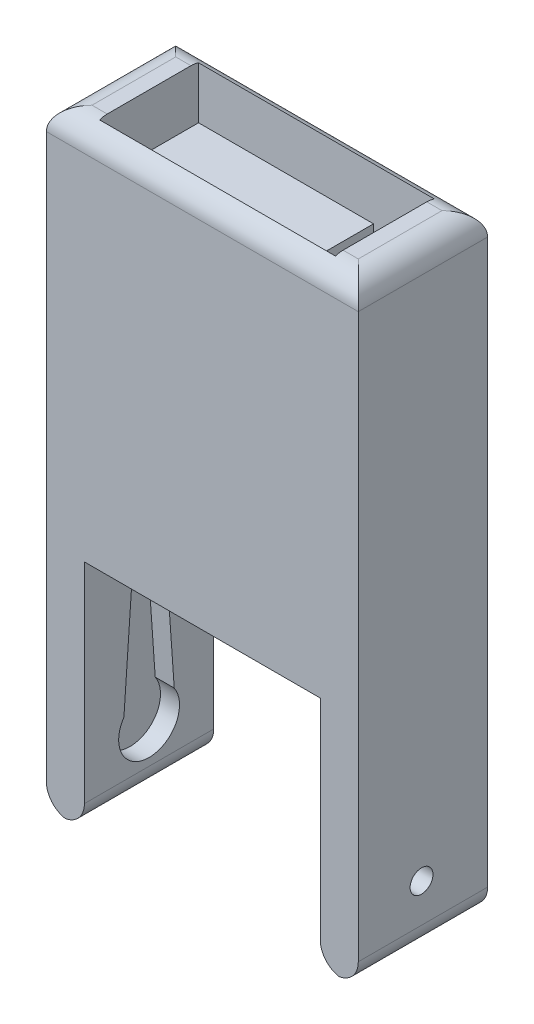
ISO-10303-21;
HEADER;
FILE_DESCRIPTION(('STEP AP214'),'2;1');
FILE_NAME('part.step','',(''),(''),'','','');
FILE_SCHEMA(('AUTOMOTIVE_DESIGN { 1 0 10303 214 1 1 1 1 }'));
ENDSEC;
DATA;
#1=APPLICATION_CONTEXT('core data for automotive mechanical design processes');
#2=APPLICATION_PROTOCOL_DEFINITION('international standard','automotive_design',2000,#1);
#3=PRODUCT_CONTEXT('',#1,'mechanical');
#4=PRODUCT('Part','Part','',(#3));
#5=PRODUCT_RELATED_PRODUCT_CATEGORY('part','',(#4));
#6=PRODUCT_DEFINITION_FORMATION('','',#4);
#7=PRODUCT_DEFINITION_CONTEXT('part definition',#1,'design');
#8=PRODUCT_DEFINITION('design','',#6,#7);
#9=PRODUCT_DEFINITION_SHAPE('','',#8);
#10=(LENGTH_UNIT() NAMED_UNIT(*) SI_UNIT(.MILLI.,.METRE.));
#11=(NAMED_UNIT(*) PLANE_ANGLE_UNIT() SI_UNIT($,.RADIAN.));
#12=(NAMED_UNIT(*) SI_UNIT($,.STERADIAN.) SOLID_ANGLE_UNIT());
#13=UNCERTAINTY_MEASURE_WITH_UNIT(LENGTH_MEASURE(1.E-05),#10,'distance_accuracy_value','');
#14=(GEOMETRIC_REPRESENTATION_CONTEXT(3) GLOBAL_UNCERTAINTY_ASSIGNED_CONTEXT((#13)) GLOBAL_UNIT_ASSIGNED_CONTEXT((#10,
#11,#12)) REPRESENTATION_CONTEXT('',''));
#15=CARTESIAN_POINT('',(0.,0.,0.));
#16=DIRECTION('',(0.,0.,1.));
#17=DIRECTION('',(1.,0.,0.));
#18=AXIS2_PLACEMENT_3D('',#15,#16,#17);
#19=CARTESIAN_POINT('',(5.,80.,0.));
#20=DIRECTION('',(-1.,0.,0.));
#21=DIRECTION('',(0.,0.,1.));
#22=AXIS2_PLACEMENT_3D('',#19,#20,#21);
#23=PLANE('',#22);
#24=DIRECTION('',(0.,-1.,0.));
#25=VECTOR('',#24,1.);
#26=CARTESIAN_POINT('',(5.,80.,15.));
#27=LINE('',#26,#25);
#28=CARTESIAN_POINT('',(5.,79.8284271247462,15.));
#29=VERTEX_POINT('',#28);
#30=CARTESIAN_POINT('',(5.,73.,15.));
#31=VERTEX_POINT('',#30);
#32=EDGE_CURVE('E53',#29,#31,#27,.T.);
#33=ORIENTED_EDGE('',*,*,#32,.T.);
#34=DIRECTION('',(0.,0.,-1.));
#35=VECTOR('',#34,1.);
#36=CARTESIAN_POINT('',(5.,73.,2.00000000000002));
#37=LINE('',#36,#35);
#38=CARTESIAN_POINT('',(5.,73.,2.00000000000001));
#39=VERTEX_POINT('',#38);
#40=EDGE_CURVE('E57',#31,#39,#37,.T.);
#41=ORIENTED_EDGE('',*,*,#40,.T.);
#42=DIRECTION('',(0.,1.,0.));
#43=VECTOR('',#42,1.);
#44=CARTESIAN_POINT('',(5.,80.,2.00000000000001));
#45=LINE('',#44,#43);
#46=CARTESIAN_POINT('',(5.,79.8284271247462,2.00000000000001));
#47=VERTEX_POINT('',#46);
#48=EDGE_CURVE('E246',#39,#47,#45,.T.);
#49=ORIENTED_EDGE('',*,*,#48,.T.);
#50=CARTESIAN_POINT('',(5.,77.,3.));
#51=DIRECTION('',(-1.,0.,0.));
#52=DIRECTION('',(0.,0.,1.));
#53=AXIS2_PLACEMENT_3D('',#50,#51,#52);
#54=CIRCLE('',#53,3.);
#55=CARTESIAN_POINT('',(5.,80.,3.));
#56=VERTEX_POINT('',#55);
#57=EDGE_CURVE('E391',#47,#56,#54,.F.);
#58=ORIENTED_EDGE('',*,*,#57,.T.);
#59=DIRECTION('',(0.,0.,-1.));
#60=VECTOR('',#59,1.);
#61=CARTESIAN_POINT('',(5.,80.,0.));
#62=LINE('',#61,#60);
#63=CARTESIAN_POINT('',(5.,80.,14.));
#64=VERTEX_POINT('',#63);
#65=EDGE_CURVE('E354',#64,#56,#62,.T.);
#66=ORIENTED_EDGE('',*,*,#65,.F.);
#67=CARTESIAN_POINT('',(5.,77.,14.));
#68=DIRECTION('',(-1.,0.,0.));
#69=DIRECTION('',(0.,0.,1.));
#70=AXIS2_PLACEMENT_3D('',#67,#68,#69);
#71=CIRCLE('',#70,3.);
#72=EDGE_CURVE('E393',#64,#29,#71,.F.);
#73=ORIENTED_EDGE('',*,*,#72,.T.);
#74=EDGE_LOOP('',(#33,#41,#49,#58,#66,#73));
#75=FACE_BOUND('',#74,.T.);
#76=ADVANCED_FACE('F36',(#75),#23,.F.);
#77=CARTESIAN_POINT('',(5.,25.2677997154365,8.5));
#78=DIRECTION('',(1.,0.,0.));
#79=DIRECTION('',(0.,0.,-1.));
#80=AXIS2_PLACEMENT_3D('',#77,#78,#79);
#81=CIRCLE('',#80,2.25);
#82=CARTESIAN_POINT('',(5.,25.2677997154365,10.75));
#83=VERTEX_POINT('',#82);
#84=CARTESIAN_POINT('',(5.,25.2677997154365,6.25));
#85=VERTEX_POINT('',#84);
#86=EDGE_CURVE('E340',#83,#85,#81,.F.);
#87=ORIENTED_EDGE('',*,*,#86,.T.);
#88=DIRECTION('',(0.,0.997531391051944,0.0702219614221419));
#89=VECTOR('',#88,1.);
#90=CARTESIAN_POINT('',(5.,-0.313205167656498,4.44920620628706));
#91=LINE('',#90,#89);
#92=CARTESIAN_POINT('',(5.,10.25,5.19281086116926));
#93=VERTEX_POINT('',#92);
#94=EDGE_CURVE('E331',#93,#85,#91,.T.);
#95=ORIENTED_EDGE('',*,*,#94,.F.);
#96=CARTESIAN_POINT('',(5.,8.,8.5));
#97=DIRECTION('',(1.,0.,0.));
#98=DIRECTION('',(0.,0.,-1.));
#99=AXIS2_PLACEMENT_3D('',#96,#97,#98);
#100=CIRCLE('',#99,4.);
#101=CARTESIAN_POINT('',(5.,10.25,11.8071891388307));
#102=VERTEX_POINT('',#101);
#103=EDGE_CURVE('E347',#102,#93,#100,.T.);
#104=ORIENTED_EDGE('',*,*,#103,.F.);
#105=DIRECTION('',(0.,0.997531391051944,-0.0702219614221418));
#106=VECTOR('',#105,1.);
#107=CARTESIAN_POINT('',(5.,0.877621216960529,12.4669646879914));
#108=LINE('',#107,#106);
#109=EDGE_CURVE('E343',#102,#83,#108,.T.);
#110=ORIENTED_EDGE('',*,*,#109,.T.);
#111=EDGE_LOOP('',(#87,#95,#104,#110));
#112=FACE_BOUND('',#111,.T.);
#113=DIRECTION('',(0.,0.,-1.));
#114=VECTOR('',#113,1.);
#115=CARTESIAN_POINT('',(5.,30.5177997154365,17.));
#116=LINE('',#115,#114);
#117=CARTESIAN_POINT('',(5.,30.5177997154365,17.));
#118=VERTEX_POINT('',#117);
#119=CARTESIAN_POINT('',(5.,30.5177997154365,0.));
#120=VERTEX_POINT('',#119);
#121=EDGE_CURVE('E308',#118,#120,#116,.T.);
#122=ORIENTED_EDGE('',*,*,#121,.F.);
#123=DIRECTION('',(0.,-1.,0.));
#124=VECTOR('',#123,1.);
#125=CARTESIAN_POINT('',(5.,80.,17.));
#126=LINE('',#125,#124);
#127=CARTESIAN_POINT('',(5.,3.,17.));
#128=VERTEX_POINT('',#127);
#129=EDGE_CURVE('E368',#118,#128,#126,.T.);
#130=ORIENTED_EDGE('',*,*,#129,.T.);
#131=DIRECTION('',(0.,0.,-1.));
#132=VECTOR('',#131,1.);
#133=CARTESIAN_POINT('',(5.,3.,0.));
#134=LINE('',#133,#132);
#135=CARTESIAN_POINT('',(5.,3.,0.));
#136=VERTEX_POINT('',#135);
#137=EDGE_CURVE('E395',#128,#136,#134,.T.);
#138=ORIENTED_EDGE('',*,*,#137,.T.);
#139=DIRECTION('',(0.,-1.,0.));
#140=VECTOR('',#139,1.);
#141=CARTESIAN_POINT('',(5.,80.,0.));
#142=LINE('',#141,#140);
#143=EDGE_CURVE('E366',#120,#136,#142,.T.);
#144=ORIENTED_EDGE('',*,*,#143,.F.);
#145=EDGE_LOOP('',(#122,#130,#138,#144));
#146=FACE_BOUND('',#145,.T.);
#147=ADVANCED_FACE('F451',(#112,#146),#23,.F.);
#148=CARTESIAN_POINT('',(0.,80.,0.));
#149=DIRECTION('',(1.,0.,0.));
#150=DIRECTION('',(0.,0.,-1.));
#151=AXIS2_PLACEMENT_3D('',#148,#149,#150);
#152=PLANE('',#151);
#153=DIRECTION('',(0.,-1.,0.));
#154=VECTOR('',#153,1.);
#155=CARTESIAN_POINT('',(0.,80.,0.));
#156=LINE('',#155,#154);
#157=CARTESIAN_POINT('',(0.,77.,0.));
#158=VERTEX_POINT('',#157);
#159=CARTESIAN_POINT('',(0.,3.,0.));
#160=VERTEX_POINT('',#159);
#161=EDGE_CURVE('E363',#158,#160,#156,.T.);
#162=ORIENTED_EDGE('',*,*,#161,.T.);
#163=DIRECTION('',(0.,0.,1.));
#164=VECTOR('',#163,1.);
#165=CARTESIAN_POINT('',(0.,3.,0.));
#166=LINE('',#165,#164);
#167=CARTESIAN_POINT('',(0.,3.,17.));
#168=VERTEX_POINT('',#167);
#169=EDGE_CURVE('E375',#160,#168,#166,.T.);
#170=ORIENTED_EDGE('',*,*,#169,.T.);
#171=DIRECTION('',(0.,-1.,0.));
#172=VECTOR('',#171,1.);
#173=CARTESIAN_POINT('',(0.,80.,17.));
#174=LINE('',#173,#172);
#175=CARTESIAN_POINT('',(0.,77.,17.));
#176=VERTEX_POINT('',#175);
#177=EDGE_CURVE('E370',#176,#168,#174,.T.);
#178=ORIENTED_EDGE('',*,*,#177,.F.);
#179=DIRECTION('',(0.,0.,1.));
#180=VECTOR('',#179,1.);
#181=CARTESIAN_POINT('',(0.,77.,0.));
#182=LINE('',#181,#180);
#183=EDGE_CURVE('E373',#176,#158,#182,.F.);
#184=ORIENTED_EDGE('',*,*,#183,.T.);
#185=EDGE_LOOP('',(#162,#170,#178,#184));
#186=FACE_BOUND('',#185,.T.);
#187=ADVANCED_FACE('F463',(#186),#152,.F.);
#188=CARTESIAN_POINT('',(0.,80.,17.));
#189=DIRECTION('',(0.,0.,-1.));
#190=DIRECTION('',(-1.,0.,0.));
#191=AXIS2_PLACEMENT_3D('',#188,#189,#190);
#192=PLANE('',#191);
#193=DIRECTION('',(1.,0.,0.));
#194=VECTOR('',#193,1.);
#195=CARTESIAN_POINT('',(-0.002000000000002,72.,17.));
#196=LINE('',#195,#194);
#197=CARTESIAN_POINT('',(5.,72.,17.));
#198=VERTEX_POINT('',#197);
#199=CARTESIAN_POINT('',(36.,72.,17.));
#200=VERTEX_POINT('',#199);
#201=EDGE_CURVE('E256',#198,#200,#196,.T.);
#202=ORIENTED_EDGE('',*,*,#201,.F.);
#203=ORIENTED_EDGE('',*,*,#201,.T.);
#204=EDGE_LOOP('',(#202,#203));
#205=FACE_BOUND('',#204,.T.);
#206=DIRECTION('',(-1.,0.,0.));
#207=VECTOR('',#206,1.);
#208=CARTESIAN_POINT('',(41.002,30.5177997154365,17.));
#209=LINE('',#208,#207);
#210=CARTESIAN_POINT('',(36.,30.5177997154365,17.));
#211=VERTEX_POINT('',#210);
#212=EDGE_CURVE('E320',#211,#118,#209,.T.);
#213=ORIENTED_EDGE('',*,*,#212,.F.);
#214=DIRECTION('',(0.,-1.,0.));
#215=VECTOR('',#214,1.);
#216=CARTESIAN_POINT('',(36.,80.,17.));
#217=LINE('',#216,#215);
#218=CARTESIAN_POINT('',(36.,3.,17.));
#219=VERTEX_POINT('',#218);
#220=EDGE_CURVE('E274',#211,#219,#217,.T.);
#221=ORIENTED_EDGE('',*,*,#220,.T.);
#222=CARTESIAN_POINT('',(39.,3.,17.));
#223=DIRECTION('',(0.,0.,-1.));
#224=DIRECTION('',(-1.,0.,0.));
#225=AXIS2_PLACEMENT_3D('',#222,#223,#224);
#226=CIRCLE('',#225,3.);
#227=CARTESIAN_POINT('',(38.5,0.041960108450196,17.));
#228=VERTEX_POINT('',#227);
#229=EDGE_CURVE('E285',#219,#228,#226,.F.);
#230=ORIENTED_EDGE('',*,*,#229,.T.);
#231=CARTESIAN_POINT('',(38.,3.,17.));
#232=DIRECTION('',(0.,0.,-1.));
#233=DIRECTION('',(-1.,0.,0.));
#234=AXIS2_PLACEMENT_3D('',#231,#232,#233);
#235=CIRCLE('',#234,3.);
#236=CARTESIAN_POINT('',(41.,3.,17.));
#237=VERTEX_POINT('',#236);
#238=EDGE_CURVE('E283',#228,#237,#235,.F.);
#239=ORIENTED_EDGE('',*,*,#238,.T.);
#240=DIRECTION('',(0.,-1.,0.));
#241=VECTOR('',#240,1.);
#242=CARTESIAN_POINT('',(41.,80.,17.));
#243=LINE('',#242,#241);
#244=CARTESIAN_POINT('',(41.,77.,17.));
#245=VERTEX_POINT('',#244);
#246=EDGE_CURVE('E271',#245,#237,#243,.T.);
#247=ORIENTED_EDGE('',*,*,#246,.F.);
#248=DIRECTION('',(1.,0.,0.));
#249=VECTOR('',#248,1.);
#250=CARTESIAN_POINT('',(0.,77.,17.));
#251=LINE('',#250,#249);
#252=EDGE_CURVE('E378',#245,#176,#251,.F.);
#253=ORIENTED_EDGE('',*,*,#252,.T.);
#254=ORIENTED_EDGE('',*,*,#177,.T.);
#255=CARTESIAN_POINT('',(3.,3.,17.));
#256=DIRECTION('',(0.,0.,-1.));
#257=DIRECTION('',(-1.,0.,0.));
#258=AXIS2_PLACEMENT_3D('',#255,#256,#257);
#259=CIRCLE('',#258,3.);
#260=CARTESIAN_POINT('',(2.5,0.0419601084501943,17.));
#261=VERTEX_POINT('',#260);
#262=EDGE_CURVE('E383',#168,#261,#259,.F.);
#263=ORIENTED_EDGE('',*,*,#262,.T.);
#264=CARTESIAN_POINT('',(2.,3.,17.));
#265=DIRECTION('',(0.,0.,-1.));
#266=DIRECTION('',(-1.,0.,0.));
#267=AXIS2_PLACEMENT_3D('',#264,#265,#266);
#268=CIRCLE('',#267,3.);
#269=EDGE_CURVE('E380',#261,#128,#268,.F.);
#270=ORIENTED_EDGE('',*,*,#269,.T.);
#271=ORIENTED_EDGE('',*,*,#129,.F.);
#272=EDGE_LOOP('',(#213,#221,#230,#239,#247,#253,#254,#263,#270,#271));
#273=FACE_BOUND('',#272,.T.);
#274=ADVANCED_FACE('F447',(#205,#273),#192,.F.);
#275=CARTESIAN_POINT('',(0.,80.,0.));
#276=DIRECTION('',(0.,0.,1.));
#277=DIRECTION('',(1.,0.,0.));
#278=AXIS2_PLACEMENT_3D('',#275,#276,#277);
#279=PLANE('',#278);
#280=DIRECTION('',(1.,0.,0.));
#281=VECTOR('',#280,1.);
#282=CARTESIAN_POINT('',(-0.00200000000000894,72.,0.));
#283=LINE('',#282,#281);
#284=CARTESIAN_POINT('',(5.,72.,0.));
#285=VERTEX_POINT('',#284);
#286=CARTESIAN_POINT('',(36.,72.,0.));
#287=VERTEX_POINT('',#286);
#288=EDGE_CURVE('E258',#285,#287,#283,.T.);
#289=ORIENTED_EDGE('',*,*,#288,.F.);
#290=ORIENTED_EDGE('',*,*,#288,.T.);
#291=EDGE_LOOP('',(#289,#290));
#292=FACE_BOUND('',#291,.T.);
#293=CARTESIAN_POINT('',(2.,3.,0.));
#294=DIRECTION('',(0.,0.,1.));
#295=DIRECTION('',(1.,0.,0.));
#296=AXIS2_PLACEMENT_3D('',#293,#294,#295);
#297=CIRCLE('',#296,3.);
#298=CARTESIAN_POINT('',(2.5,0.0419601084501947,0.));
#299=VERTEX_POINT('',#298);
#300=EDGE_CURVE('E387',#136,#299,#297,.F.);
#301=ORIENTED_EDGE('',*,*,#300,.T.);
#302=CARTESIAN_POINT('',(3.,3.,0.));
#303=DIRECTION('',(0.,0.,1.));
#304=DIRECTION('',(1.,0.,0.));
#305=AXIS2_PLACEMENT_3D('',#302,#303,#304);
#306=CIRCLE('',#305,3.);
#307=EDGE_CURVE('E389',#299,#160,#306,.F.);
#308=ORIENTED_EDGE('',*,*,#307,.T.);
#309=ORIENTED_EDGE('',*,*,#161,.F.);
#310=DIRECTION('',(-1.,0.,0.));
#311=VECTOR('',#310,1.);
#312=CARTESIAN_POINT('',(5.,77.,0.));
#313=LINE('',#312,#311);
#314=CARTESIAN_POINT('',(41.,77.,0.));
#315=VERTEX_POINT('',#314);
#316=EDGE_CURVE('E385',#158,#315,#313,.F.);
#317=ORIENTED_EDGE('',*,*,#316,.T.);
#318=DIRECTION('',(0.,-1.,0.));
#319=VECTOR('',#318,1.);
#320=CARTESIAN_POINT('',(41.,80.,0.));
#321=LINE('',#320,#319);
#322=CARTESIAN_POINT('',(41.,3.,0.));
#323=VERTEX_POINT('',#322);
#324=EDGE_CURVE('E268',#315,#323,#321,.T.);
#325=ORIENTED_EDGE('',*,*,#324,.T.);
#326=CARTESIAN_POINT('',(38.,3.,0.));
#327=DIRECTION('',(0.,0.,1.));
#328=DIRECTION('',(1.,0.,0.));
#329=AXIS2_PLACEMENT_3D('',#326,#327,#328);
#330=CIRCLE('',#329,3.);
#331=CARTESIAN_POINT('',(38.5,0.041960108450196,0.));
#332=VERTEX_POINT('',#331);
#333=EDGE_CURVE('E295',#323,#332,#330,.F.);
#334=ORIENTED_EDGE('',*,*,#333,.T.);
#335=CARTESIAN_POINT('',(39.,3.,0.));
#336=DIRECTION('',(0.,0.,1.));
#337=DIRECTION('',(1.,0.,0.));
#338=AXIS2_PLACEMENT_3D('',#335,#336,#337);
#339=CIRCLE('',#338,3.);
#340=CARTESIAN_POINT('',(36.,3.,0.));
#341=VERTEX_POINT('',#340);
#342=EDGE_CURVE('E297',#332,#341,#339,.F.);
#343=ORIENTED_EDGE('',*,*,#342,.T.);
#344=DIRECTION('',(0.,-1.,0.));
#345=VECTOR('',#344,1.);
#346=CARTESIAN_POINT('',(36.,80.,0.));
#347=LINE('',#346,#345);
#348=CARTESIAN_POINT('',(36.,30.5177997154365,0.));
#349=VERTEX_POINT('',#348);
#350=EDGE_CURVE('E266',#349,#341,#347,.T.);
#351=ORIENTED_EDGE('',*,*,#350,.F.);
#352=DIRECTION('',(-1.,0.,0.));
#353=VECTOR('',#352,1.);
#354=CARTESIAN_POINT('',(41.002,30.5177997154365,0.));
#355=LINE('',#354,#353);
#356=EDGE_CURVE('E319',#349,#120,#355,.T.);
#357=ORIENTED_EDGE('',*,*,#356,.T.);
#358=ORIENTED_EDGE('',*,*,#143,.T.);
#359=EDGE_LOOP('',(#301,#308,#309,#317,#325,#334,#343,#351,#357,#358));
#360=FACE_BOUND('',#359,.T.);
#361=ADVANCED_FACE('F422',(#292,#360),#279,.F.);
#362=CARTESIAN_POINT('',(0.,80.,0.));
#363=DIRECTION('',(0.,1.,0.));
#364=DIRECTION('',(0.,0.,1.));
#365=AXIS2_PLACEMENT_3D('',#362,#363,#364);
#366=PLANE('',#365);
#367=DIRECTION('',(0.,0.,1.));
#368=VECTOR('',#367,1.);
#369=CARTESIAN_POINT('',(3.,80.,17.));
#370=LINE('',#369,#368);
#371=CARTESIAN_POINT('',(3.,80.,3.));
#372=VERTEX_POINT('',#371);
#373=CARTESIAN_POINT('',(3.,80.,14.));
#374=VERTEX_POINT('',#373);
#375=EDGE_CURVE('E45',#372,#374,#370,.T.);
#376=ORIENTED_EDGE('',*,*,#375,.T.);
#377=DIRECTION('',(1.,0.,0.));
#378=VECTOR('',#377,1.);
#379=CARTESIAN_POINT('',(5.,80.,14.));
#380=LINE('',#379,#378);
#381=EDGE_CURVE('E11',#374,#64,#380,.T.);
#382=ORIENTED_EDGE('',*,*,#381,.T.);
#383=ORIENTED_EDGE('',*,*,#65,.T.);
#384=DIRECTION('',(-1.,0.,0.));
#385=VECTOR('',#384,1.);
#386=CARTESIAN_POINT('',(0.,80.,3.));
#387=LINE('',#386,#385);
#388=EDGE_CURVE('E398',#56,#372,#387,.T.);
#389=ORIENTED_EDGE('',*,*,#388,.T.);
#390=EDGE_LOOP('',(#376,#382,#383,#389));
#391=FACE_BOUND('',#390,.T.);
#392=ADVANCED_FACE('F605',(#391),#366,.T.);
#393=CARTESIAN_POINT('',(2.5,25.2677997154365,8.5));
#394=DIRECTION('',(1.,0.,0.));
#395=DIRECTION('',(0.,0.,-1.));
#396=AXIS2_PLACEMENT_3D('',#393,#394,#395);
#397=CYLINDRICAL_SURFACE('',#396,2.25);
#398=ORIENTED_EDGE('',*,*,#86,.F.);
#399=DIRECTION('',(1.,0.,0.));
#400=VECTOR('',#399,1.);
#401=CARTESIAN_POINT('',(2.5,25.2677997154365,10.75));
#402=LINE('',#401,#400);
#403=CARTESIAN_POINT('',(2.5,25.2677997154365,10.75));
#404=VERTEX_POINT('',#403);
#405=EDGE_CURVE('E339',#404,#83,#402,.T.);
#406=ORIENTED_EDGE('',*,*,#405,.F.);
#407=CARTESIAN_POINT('',(2.5,25.2677997154365,8.5));
#408=DIRECTION('',(1.,0.,0.));
#409=DIRECTION('',(0.,0.,-1.));
#410=AXIS2_PLACEMENT_3D('',#407,#408,#409);
#411=CIRCLE('',#410,2.25);
#412=CARTESIAN_POINT('',(2.5,25.2677997154365,6.25));
#413=VERTEX_POINT('',#412);
#414=EDGE_CURVE('E328',#404,#413,#411,.F.);
#415=ORIENTED_EDGE('',*,*,#414,.T.);
#416=DIRECTION('',(1.,0.,0.));
#417=VECTOR('',#416,1.);
#418=CARTESIAN_POINT('',(2.5,25.2677997154365,6.25));
#419=LINE('',#418,#417);
#420=EDGE_CURVE('E352',#413,#85,#419,.T.);
#421=ORIENTED_EDGE('',*,*,#420,.T.);
#422=EDGE_LOOP('',(#398,#406,#415,#421));
#423=FACE_BOUND('',#422,.T.);
#424=ADVANCED_FACE('F597',(#423),#397,.F.);
#425=CARTESIAN_POINT('',(2.5,-0.313205167656498,4.44920620628706));
#426=DIRECTION('',(0.,0.0702219614221419,-0.997531391051944));
#427=DIRECTION('',(0.,0.997531391051944,0.0702219614221419));
#428=AXIS2_PLACEMENT_3D('',#425,#426,#427);
#429=PLANE('',#428);
#430=ORIENTED_EDGE('',*,*,#94,.T.);
#431=ORIENTED_EDGE('',*,*,#420,.F.);
#432=DIRECTION('',(0.,0.997531391051944,0.0702219614221419));
#433=VECTOR('',#432,1.);
#434=CARTESIAN_POINT('',(2.5,-0.313205167656498,4.44920620628706));
#435=LINE('',#434,#433);
#436=CARTESIAN_POINT('',(2.5,10.25,5.19281086116926));
#437=VERTEX_POINT('',#436);
#438=EDGE_CURVE('E336',#437,#413,#435,.T.);
#439=ORIENTED_EDGE('',*,*,#438,.F.);
#440=DIRECTION('',(1.,0.,0.));
#441=VECTOR('',#440,1.);
#442=CARTESIAN_POINT('',(2.5,10.25,5.19281086116926));
#443=LINE('',#442,#441);
#444=EDGE_CURVE('E355',#437,#93,#443,.T.);
#445=ORIENTED_EDGE('',*,*,#444,.T.);
#446=EDGE_LOOP('',(#430,#431,#439,#445));
#447=FACE_BOUND('',#446,.T.);
#448=ADVANCED_FACE('F589',(#447),#429,.F.);
#449=CARTESIAN_POINT('',(2.5,8.,8.5));
#450=DIRECTION('',(1.,0.,0.));
#451=DIRECTION('',(0.,0.,-1.));
#452=AXIS2_PLACEMENT_3D('',#449,#450,#451);
#453=CYLINDRICAL_SURFACE('',#452,4.);
#454=ORIENTED_EDGE('',*,*,#103,.T.);
#455=ORIENTED_EDGE('',*,*,#444,.F.);
#456=CARTESIAN_POINT('',(2.5,8.,8.5));
#457=DIRECTION('',(1.,0.,0.));
#458=DIRECTION('',(0.,0.,-1.));
#459=AXIS2_PLACEMENT_3D('',#456,#457,#458);
#460=CIRCLE('',#459,4.);
#461=CARTESIAN_POINT('',(2.5,10.25,11.8071891388307));
#462=VERTEX_POINT('',#461);
#463=EDGE_CURVE('E333',#462,#437,#460,.T.);
#464=ORIENTED_EDGE('',*,*,#463,.F.);
#465=DIRECTION('',(1.,0.,0.));
#466=VECTOR('',#465,1.);
#467=CARTESIAN_POINT('',(2.5,10.25,11.8071891388307));
#468=LINE('',#467,#466);
#469=EDGE_CURVE('E357',#462,#102,#468,.T.);
#470=ORIENTED_EDGE('',*,*,#469,.T.);
#471=EDGE_LOOP('',(#454,#455,#464,#470));
#472=FACE_BOUND('',#471,.T.);
#473=ADVANCED_FACE('F581',(#472),#453,.F.);
#474=CARTESIAN_POINT('',(2.5,0.877621216960529,12.4669646879914));
#475=DIRECTION('',(0.,-0.0702219614221418,-0.997531391051944));
#476=DIRECTION('',(0.,0.997531391051944,-0.0702219614221418));
#477=AXIS2_PLACEMENT_3D('',#474,#475,#476);
#478=PLANE('',#477);
#479=ORIENTED_EDGE('',*,*,#109,.F.);
#480=ORIENTED_EDGE('',*,*,#469,.F.);
#481=DIRECTION('',(0.,0.997531391051944,-0.0702219614221418));
#482=VECTOR('',#481,1.);
#483=CARTESIAN_POINT('',(2.5,0.877621216960529,12.4669646879914));
#484=LINE('',#483,#482);
#485=EDGE_CURVE('E330',#462,#404,#484,.T.);
#486=ORIENTED_EDGE('',*,*,#485,.T.);
#487=ORIENTED_EDGE('',*,*,#405,.T.);
#488=EDGE_LOOP('',(#479,#480,#486,#487));
#489=FACE_BOUND('',#488,.T.);
#490=ADVANCED_FACE('F572',(#489),#478,.T.);
#491=CARTESIAN_POINT('',(2.5,0.,0.));
#492=DIRECTION('',(1.,0.,0.));
#493=DIRECTION('',(0.,0.,-1.));
#494=AXIS2_PLACEMENT_3D('',#491,#492,#493);
#495=PLANE('',#494);
#496=ORIENTED_EDGE('',*,*,#414,.F.);
#497=ORIENTED_EDGE('',*,*,#485,.F.);
#498=ORIENTED_EDGE('',*,*,#463,.T.);
#499=ORIENTED_EDGE('',*,*,#438,.T.);
#500=EDGE_LOOP('',(#496,#497,#498,#499));
#501=FACE_BOUND('',#500,.T.);
#502=ADVANCED_FACE('F547',(#501),#495,.T.);
#503=CARTESIAN_POINT('',(2.,3.,0.));
#504=DIRECTION('',(0.,0.,-1.));
#505=DIRECTION('',(-1.,0.,0.));
#506=AXIS2_PLACEMENT_3D('',#503,#504,#505);
#507=CYLINDRICAL_SURFACE('',#506,3.);
#508=DIRECTION('',(0.,0.,-1.));
#509=VECTOR('',#508,1.);
#510=CARTESIAN_POINT('',(2.5,0.0419601084501939,8.5));
#511=LINE('',#510,#509);
#512=EDGE_CURVE('E344',#299,#261,#511,.F.);
#513=ORIENTED_EDGE('',*,*,#512,.F.);
#514=ORIENTED_EDGE('',*,*,#300,.F.);
#515=ORIENTED_EDGE('',*,*,#137,.F.);
#516=ORIENTED_EDGE('',*,*,#269,.F.);
#517=EDGE_LOOP('',(#513,#514,#515,#516));
#518=FACE_BOUND('',#517,.T.);
#519=ADVANCED_FACE('F457',(#518),#507,.T.);
#520=CARTESIAN_POINT('',(3.,3.,0.));
#521=DIRECTION('',(0.,0.,1.));
#522=DIRECTION('',(1.,0.,0.));
#523=AXIS2_PLACEMENT_3D('',#520,#521,#522);
#524=CYLINDRICAL_SURFACE('',#523,3.);
#525=ORIENTED_EDGE('',*,*,#307,.F.);
#526=ORIENTED_EDGE('',*,*,#512,.T.);
#527=ORIENTED_EDGE('',*,*,#262,.F.);
#528=ORIENTED_EDGE('',*,*,#169,.F.);
#529=EDGE_LOOP('',(#525,#526,#527,#528));
#530=FACE_BOUND('',#529,.T.);
#531=ADVANCED_FACE('F460',(#530),#524,.T.);
#532=CARTESIAN_POINT('',(0.,77.,3.));
#533=DIRECTION('',(1.,0.,0.));
#534=DIRECTION('',(0.,0.,-1.));
#535=AXIS2_PLACEMENT_3D('',#532,#533,#534);
#536=CYLINDRICAL_SURFACE('',#535,3.);
#537=ORIENTED_EDGE('',*,*,#57,.F.);
#538=DIRECTION('',(1.,0.,0.));
#539=VECTOR('',#538,1.);
#540=CARTESIAN_POINT('',(36.,79.8284271247462,2.));
#541=LINE('',#540,#539);
#542=CARTESIAN_POINT('',(36.,79.8284271247462,2.));
#543=VERTEX_POINT('',#542);
#544=EDGE_CURVE('E293',#543,#47,#541,.F.);
#545=ORIENTED_EDGE('',*,*,#544,.F.);
#546=CARTESIAN_POINT('',(36.,77.,3.));
#547=DIRECTION('',(1.,0.,0.));
#548=DIRECTION('',(0.,0.,-1.));
#549=AXIS2_PLACEMENT_3D('',#546,#547,#548);
#550=CIRCLE('',#549,3.);
#551=CARTESIAN_POINT('',(36.,80.,3.));
#552=VERTEX_POINT('',#551);
#553=EDGE_CURVE('E289',#552,#543,#550,.F.);
#554=ORIENTED_EDGE('',*,*,#553,.F.);
#555=DIRECTION('',(-1.,0.,0.));
#556=VECTOR('',#555,1.);
#557=CARTESIAN_POINT('',(5.,80.,3.));
#558=LINE('',#557,#556);
#559=CARTESIAN_POINT('',(38.,80.,3.));
#560=VERTEX_POINT('',#559);
#561=EDGE_CURVE('E278',#560,#552,#558,.T.);
#562=ORIENTED_EDGE('',*,*,#561,.F.);
#563=CARTESIAN_POINT('',(38.,77.,3.));
#564=DIRECTION('',(0.707106781186547,0.,0.707106781186547));
#565=DIRECTION('',(-0.707106781186547,0.,0.707106781186547));
#566=AXIS2_PLACEMENT_3D('',#563,#564,#565);
#567=ELLIPSE('',#566,4.24264068711928,3.);
#568=EDGE_CURVE('E311',#315,#560,#567,.T.);
#569=ORIENTED_EDGE('',*,*,#568,.F.);
#570=ORIENTED_EDGE('',*,*,#316,.F.);
#571=CARTESIAN_POINT('',(3.,77.,3.));
#572=DIRECTION('',(0.707106781186547,0.,-0.707106781186548));
#573=DIRECTION('',(0.707106781186548,0.,0.707106781186547));
#574=AXIS2_PLACEMENT_3D('',#571,#572,#573);
#575=ELLIPSE('',#574,4.24264068711929,3.);
#576=EDGE_CURVE('E40',#372,#158,#575,.F.);
#577=ORIENTED_EDGE('',*,*,#576,.F.);
#578=ORIENTED_EDGE('',*,*,#388,.F.);
#579=EDGE_LOOP('',(#537,#545,#554,#562,#569,#570,#577,#578));
#580=FACE_BOUND('',#579,.T.);
#581=ADVANCED_FACE('F38',(#580),#536,.T.);
#582=CARTESIAN_POINT('',(3.,77.,0.));
#583=DIRECTION('',(0.,0.,-1.));
#584=DIRECTION('',(-1.,0.,0.));
#585=AXIS2_PLACEMENT_3D('',#582,#583,#584);
#586=CYLINDRICAL_SURFACE('',#585,3.);
#587=ORIENTED_EDGE('',*,*,#576,.T.);
#588=ORIENTED_EDGE('',*,*,#183,.F.);
#589=CARTESIAN_POINT('',(3.,77.,14.));
#590=DIRECTION('',(-0.707106781186548,0.,-0.707106781186547));
#591=DIRECTION('',(0.707106781186547,0.,-0.707106781186548));
#592=AXIS2_PLACEMENT_3D('',#589,#590,#591);
#593=ELLIPSE('',#592,4.24264068711928,3.);
#594=EDGE_CURVE('E327',#374,#176,#593,.F.);
#595=ORIENTED_EDGE('',*,*,#594,.F.);
#596=ORIENTED_EDGE('',*,*,#375,.F.);
#597=EDGE_LOOP('',(#587,#588,#595,#596));
#598=FACE_BOUND('',#597,.T.);
#599=ADVANCED_FACE('F411',(#598),#586,.T.);
#600=CARTESIAN_POINT('',(0.,77.,14.));
#601=DIRECTION('',(-1.,0.,0.));
#602=DIRECTION('',(0.,0.,1.));
#603=AXIS2_PLACEMENT_3D('',#600,#601,#602);
#604=CYLINDRICAL_SURFACE('',#603,3.);
#605=ORIENTED_EDGE('',*,*,#594,.T.);
#606=ORIENTED_EDGE('',*,*,#252,.F.);
#607=CARTESIAN_POINT('',(38.,77.,14.));
#608=DIRECTION('',(-0.707106781186547,0.,0.707106781186547));
#609=DIRECTION('',(0.707106781186547,0.,0.707106781186547));
#610=AXIS2_PLACEMENT_3D('',#607,#608,#609);
#611=ELLIPSE('',#610,4.24264068711928,3.);
#612=CARTESIAN_POINT('',(38.,80.,14.));
#613=VERTEX_POINT('',#612);
#614=EDGE_CURVE('E309',#245,#613,#611,.T.);
#615=ORIENTED_EDGE('',*,*,#614,.T.);
#616=DIRECTION('',(1.,0.,0.));
#617=VECTOR('',#616,1.);
#618=CARTESIAN_POINT('',(41.,80.,14.));
#619=LINE('',#618,#617);
#620=CARTESIAN_POINT('',(36.,80.,14.));
#621=VERTEX_POINT('',#620);
#622=EDGE_CURVE('E280',#621,#613,#619,.T.);
#623=ORIENTED_EDGE('',*,*,#622,.F.);
#624=CARTESIAN_POINT('',(36.,77.,14.));
#625=DIRECTION('',(1.,0.,0.));
#626=DIRECTION('',(0.,0.,-1.));
#627=AXIS2_PLACEMENT_3D('',#624,#625,#626);
#628=CIRCLE('',#627,3.);
#629=CARTESIAN_POINT('',(36.,79.8284271247462,15.));
#630=VERTEX_POINT('',#629);
#631=EDGE_CURVE('E291',#630,#621,#628,.F.);
#632=ORIENTED_EDGE('',*,*,#631,.F.);
#633=DIRECTION('',(-1.,0.,0.));
#634=VECTOR('',#633,1.);
#635=CARTESIAN_POINT('',(5.,79.8284271247462,15.));
#636=LINE('',#635,#634);
#637=EDGE_CURVE('E287',#29,#630,#636,.F.);
#638=ORIENTED_EDGE('',*,*,#637,.F.);
#639=ORIENTED_EDGE('',*,*,#72,.F.);
#640=ORIENTED_EDGE('',*,*,#381,.F.);
#641=EDGE_LOOP('',(#605,#606,#615,#623,#632,#638,#639,#640));
#642=FACE_BOUND('',#641,.T.);
#643=ADVANCED_FACE('F465',(#642),#604,.T.);
#644=CARTESIAN_POINT('',(41.002,30.5177997154365,17.));
#645=DIRECTION('',(0.,1.,0.));
#646=DIRECTION('',(0.,0.,1.));
#647=AXIS2_PLACEMENT_3D('',#644,#645,#646);
#648=PLANE('',#647);
#649=DIRECTION('',(0.,0.,-1.));
#650=VECTOR('',#649,1.);
#651=CARTESIAN_POINT('',(36.,30.5177997154365,17.));
#652=LINE('',#651,#650);
#653=EDGE_CURVE('E322',#211,#349,#652,.T.);
#654=ORIENTED_EDGE('',*,*,#653,.F.);
#655=ORIENTED_EDGE('',*,*,#212,.T.);
#656=ORIENTED_EDGE('',*,*,#121,.T.);
#657=ORIENTED_EDGE('',*,*,#356,.F.);
#658=EDGE_LOOP('',(#654,#655,#656,#657));
#659=FACE_BOUND('',#658,.T.);
#660=ADVANCED_FACE('F443',(#659),#648,.F.);
#661=CARTESIAN_POINT('',(36.,80.,0.));
#662=DIRECTION('',(1.,0.,0.));
#663=DIRECTION('',(0.,0.,-1.));
#664=AXIS2_PLACEMENT_3D('',#661,#662,#663);
#665=PLANE('',#664);
#666=CARTESIAN_POINT('',(36.,8.0419601084502,8.68637656111559));
#667=DIRECTION('',(-1.,0.,0.));
#668=DIRECTION('',(0.,0.,1.));
#669=AXIS2_PLACEMENT_3D('',#666,#667,#668);
#670=CIRCLE('',#669,1.5);
#671=CARTESIAN_POINT('',(36.,8.0419601084502,10.1863765611156));
#672=VERTEX_POINT('',#671);
#673=EDGE_CURVE('E503',#672,#672,#670,.T.);
#674=ORIENTED_EDGE('',*,*,#673,.F.);
#675=EDGE_LOOP('',(#674));
#676=FACE_BOUND('',#675,.T.);
#677=ORIENTED_EDGE('',*,*,#220,.F.);
#678=ORIENTED_EDGE('',*,*,#653,.T.);
#679=ORIENTED_EDGE('',*,*,#350,.T.);
#680=DIRECTION('',(0.,0.,1.));
#681=VECTOR('',#680,1.);
#682=CARTESIAN_POINT('',(36.,3.,0.));
#683=LINE('',#682,#681);
#684=EDGE_CURVE('E300',#341,#219,#683,.T.);
#685=ORIENTED_EDGE('',*,*,#684,.T.);
#686=EDGE_LOOP('',(#677,#678,#679,#685));
#687=FACE_BOUND('',#686,.T.);
#688=ADVANCED_FACE('F440',(#676,#687),#665,.F.);
#689=CARTESIAN_POINT('',(-0.00200000000000894,73.,2.00000000000002));
#690=DIRECTION('',(0.,-1.,0.));
#691=DIRECTION('',(0.,0.,-1.));
#692=AXIS2_PLACEMENT_3D('',#689,#690,#691);
#693=PLANE('',#692);
#694=DIRECTION('',(1.,0.,0.));
#695=VECTOR('',#694,1.);
#696=CARTESIAN_POINT('',(-0.00200000000000894,73.,2.00000000000002));
#697=LINE('',#696,#695);
#698=CARTESIAN_POINT('',(31.,73.,2.));
#699=VERTEX_POINT('',#698);
#700=CARTESIAN_POINT('',(36.,73.,2.));
#701=VERTEX_POINT('',#700);
#702=EDGE_CURVE('E248',#699,#701,#697,.T.);
#703=ORIENTED_EDGE('',*,*,#702,.F.);
#704=DIRECTION('',(0.,0.,-1.));
#705=VECTOR('',#704,1.);
#706=CARTESIAN_POINT('',(31.,73.,15.));
#707=LINE('',#706,#705);
#708=CARTESIAN_POINT('',(31.,73.,15.));
#709=VERTEX_POINT('',#708);
#710=EDGE_CURVE('E241',#709,#699,#707,.T.);
#711=ORIENTED_EDGE('',*,*,#710,.F.);
#712=DIRECTION('',(1.,0.,0.));
#713=VECTOR('',#712,1.);
#714=CARTESIAN_POINT('',(-0.002000000000002,73.,15.));
#715=LINE('',#714,#713);
#716=CARTESIAN_POINT('',(36.,73.,15.));
#717=VERTEX_POINT('',#716);
#718=EDGE_CURVE('E247',#709,#717,#715,.T.);
#719=ORIENTED_EDGE('',*,*,#718,.T.);
#720=DIRECTION('',(0.,0.,-1.));
#721=VECTOR('',#720,1.);
#722=CARTESIAN_POINT('',(36.,73.,2.));
#723=LINE('',#722,#721);
#724=EDGE_CURVE('E484',#717,#701,#723,.T.);
#725=ORIENTED_EDGE('',*,*,#724,.T.);
#726=EDGE_LOOP('',(#703,#711,#719,#725));
#727=FACE_BOUND('',#726,.T.);
#728=ADVANCED_FACE('F518',(#727),#693,.F.);
#729=DIRECTION('',(0.,-1.,0.));
#730=VECTOR('',#729,1.);
#731=CARTESIAN_POINT('',(36.,80.,15.));
#732=LINE('',#731,#730);
#733=EDGE_CURVE('E485',#630,#717,#732,.T.);
#734=ORIENTED_EDGE('',*,*,#733,.F.);
#735=ORIENTED_EDGE('',*,*,#631,.T.);
#736=DIRECTION('',(0.,0.,1.));
#737=VECTOR('',#736,1.);
#738=CARTESIAN_POINT('',(36.,80.,0.));
#739=LINE('',#738,#737);
#740=EDGE_CURVE('E261',#552,#621,#739,.T.);
#741=ORIENTED_EDGE('',*,*,#740,.F.);
#742=ORIENTED_EDGE('',*,*,#553,.T.);
#743=DIRECTION('',(0.,1.,0.));
#744=VECTOR('',#743,1.);
#745=CARTESIAN_POINT('',(36.,80.,2.));
#746=LINE('',#745,#744);
#747=EDGE_CURVE('E252',#701,#543,#746,.T.);
#748=ORIENTED_EDGE('',*,*,#747,.F.);
#749=ORIENTED_EDGE('',*,*,#724,.F.);
#750=EDGE_LOOP('',(#734,#735,#741,#742,#748,#749));
#751=FACE_BOUND('',#750,.T.);
#752=ADVANCED_FACE('F477',(#751),#665,.F.);
#753=CARTESIAN_POINT('',(41.,80.,0.));
#754=DIRECTION('',(-1.,0.,0.));
#755=DIRECTION('',(0.,0.,1.));
#756=AXIS2_PLACEMENT_3D('',#753,#754,#755);
#757=PLANE('',#756);
#758=CARTESIAN_POINT('',(41.,8.0419601084502,8.6863765611156));
#759=DIRECTION('',(-1.,0.,0.));
#760=DIRECTION('',(0.,0.,1.));
#761=AXIS2_PLACEMENT_3D('',#758,#759,#760);
#762=CIRCLE('',#761,1.5);
#763=CARTESIAN_POINT('',(41.,8.0419601084502,10.1863765611156));
#764=VERTEX_POINT('',#763);
#765=EDGE_CURVE('E317',#764,#764,#762,.T.);
#766=ORIENTED_EDGE('',*,*,#765,.T.);
#767=EDGE_LOOP('',(#766));
#768=FACE_BOUND('',#767,.T.);
#769=ORIENTED_EDGE('',*,*,#246,.T.);
#770=DIRECTION('',(0.,0.,-1.));
#771=VECTOR('',#770,1.);
#772=CARTESIAN_POINT('',(41.,3.,0.));
#773=LINE('',#772,#771);
#774=EDGE_CURVE('E306',#237,#323,#773,.T.);
#775=ORIENTED_EDGE('',*,*,#774,.T.);
#776=ORIENTED_EDGE('',*,*,#324,.F.);
#777=DIRECTION('',(0.,0.,-1.));
#778=VECTOR('',#777,1.);
#779=CARTESIAN_POINT('',(41.,77.,17.));
#780=LINE('',#779,#778);
#781=EDGE_CURVE('E303',#315,#245,#780,.F.);
#782=ORIENTED_EDGE('',*,*,#781,.T.);
#783=EDGE_LOOP('',(#769,#775,#776,#782));
#784=FACE_BOUND('',#783,.T.);
#785=ADVANCED_FACE('F425',(#768,#784),#757,.F.);
#786=CARTESIAN_POINT('',(0.,80.,0.));
#787=DIRECTION('',(0.,1.,0.));
#788=DIRECTION('',(0.,0.,1.));
#789=AXIS2_PLACEMENT_3D('',#786,#787,#788);
#790=PLANE('',#789);
#791=ORIENTED_EDGE('',*,*,#740,.T.);
#792=ORIENTED_EDGE('',*,*,#622,.T.);
#793=DIRECTION('',(0.,0.,-1.));
#794=VECTOR('',#793,1.);
#795=CARTESIAN_POINT('',(38.,80.,0.));
#796=LINE('',#795,#794);
#797=EDGE_CURVE('E276',#613,#560,#796,.T.);
#798=ORIENTED_EDGE('',*,*,#797,.T.);
#799=ORIENTED_EDGE('',*,*,#561,.T.);
#800=EDGE_LOOP('',(#791,#792,#798,#799));
#801=FACE_BOUND('',#800,.T.);
#802=ADVANCED_FACE('F472',(#801),#790,.T.);
#803=CARTESIAN_POINT('',(-0.002000000000002,80.,15.));
#804=DIRECTION('',(0.,0.,1.));
#805=DIRECTION('',(1.,0.,0.));
#806=AXIS2_PLACEMENT_3D('',#803,#804,#805);
#807=PLANE('',#806);
#808=ORIENTED_EDGE('',*,*,#32,.F.);
#809=ORIENTED_EDGE('',*,*,#637,.T.);
#810=ORIENTED_EDGE('',*,*,#733,.T.);
#811=ORIENTED_EDGE('',*,*,#718,.F.);
#812=DIRECTION('',(0.,1.,0.));
#813=VECTOR('',#812,1.);
#814=CARTESIAN_POINT('',(31.,-0.001000000000001,15.));
#815=LINE('',#814,#813);
#816=CARTESIAN_POINT('',(31.,68.,15.));
#817=VERTEX_POINT('',#816);
#818=EDGE_CURVE('E491',#817,#709,#815,.T.);
#819=ORIENTED_EDGE('',*,*,#818,.F.);
#820=DIRECTION('',(-1.,0.,0.));
#821=VECTOR('',#820,1.);
#822=CARTESIAN_POINT('',(31.,68.,15.));
#823=LINE('',#822,#821);
#824=CARTESIAN_POINT('',(28.,68.,15.));
#825=VERTEX_POINT('',#824);
#826=EDGE_CURVE('E499',#817,#825,#823,.T.);
#827=ORIENTED_EDGE('',*,*,#826,.T.);
#828=DIRECTION('',(0.,1.,0.));
#829=VECTOR('',#828,1.);
#830=CARTESIAN_POINT('',(28.,-0.001000000000001,15.));
#831=LINE('',#830,#829);
#832=CARTESIAN_POINT('',(28.,73.,15.));
#833=VERTEX_POINT('',#832);
#834=EDGE_CURVE('E232',#825,#833,#831,.T.);
#835=ORIENTED_EDGE('',*,*,#834,.T.);
#836=EDGE_CURVE('E240',#31,#833,#715,.T.);
#837=ORIENTED_EDGE('',*,*,#836,.F.);
#838=EDGE_LOOP('',(#808,#809,#810,#811,#819,#827,#835,#837));
#839=FACE_BOUND('',#838,.T.);
#840=ADVANCED_FACE('F726',(#839),#807,.F.);
#841=ORIENTED_EDGE('',*,*,#836,.T.);
#842=DIRECTION('',(0.,0.,1.));
#843=VECTOR('',#842,1.);
#844=CARTESIAN_POINT('',(28.,73.,15.));
#845=LINE('',#844,#843);
#846=CARTESIAN_POINT('',(28.,73.,2.00000000000001));
#847=VERTEX_POINT('',#846);
#848=EDGE_CURVE('E226',#847,#833,#845,.T.);
#849=ORIENTED_EDGE('',*,*,#848,.F.);
#850=EDGE_CURVE('E238',#39,#847,#697,.T.);
#851=ORIENTED_EDGE('',*,*,#850,.F.);
#852=ORIENTED_EDGE('',*,*,#40,.F.);
#853=EDGE_LOOP('',(#841,#849,#851,#852));
#854=FACE_BOUND('',#853,.T.);
#855=ADVANCED_FACE('F237',(#854),#693,.F.);
#856=CARTESIAN_POINT('',(-0.00200000000000894,80.,2.00000000000002));
#857=DIRECTION('',(0.,0.,-1.));
#858=DIRECTION('',(-1.,0.,0.));
#859=AXIS2_PLACEMENT_3D('',#856,#857,#858);
#860=PLANE('',#859);
#861=ORIENTED_EDGE('',*,*,#747,.T.);
#862=ORIENTED_EDGE('',*,*,#544,.T.);
#863=ORIENTED_EDGE('',*,*,#48,.F.);
#864=ORIENTED_EDGE('',*,*,#850,.T.);
#865=DIRECTION('',(0.,1.,0.));
#866=VECTOR('',#865,1.);
#867=CARTESIAN_POINT('',(28.,-0.001000000000001,2.00000000000001));
#868=LINE('',#867,#866);
#869=CARTESIAN_POINT('',(28.,68.,2.00000000000001));
#870=VERTEX_POINT('',#869);
#871=EDGE_CURVE('E222',#870,#847,#868,.T.);
#872=ORIENTED_EDGE('',*,*,#871,.F.);
#873=DIRECTION('',(1.,0.,0.));
#874=VECTOR('',#873,1.);
#875=CARTESIAN_POINT('',(31.,68.,2.00000000000001));
#876=LINE('',#875,#874);
#877=CARTESIAN_POINT('',(31.,68.,2.));
#878=VERTEX_POINT('',#877);
#879=EDGE_CURVE('E487',#870,#878,#876,.T.);
#880=ORIENTED_EDGE('',*,*,#879,.T.);
#881=DIRECTION('',(0.,1.,0.));
#882=VECTOR('',#881,1.);
#883=CARTESIAN_POINT('',(31.,-0.001000000000001,2.00000000000001));
#884=LINE('',#883,#882);
#885=EDGE_CURVE('E233',#878,#699,#884,.T.);
#886=ORIENTED_EDGE('',*,*,#885,.T.);
#887=ORIENTED_EDGE('',*,*,#702,.T.);
#888=EDGE_LOOP('',(#861,#862,#863,#864,#872,#880,#886,#887));
#889=FACE_BOUND('',#888,.T.);
#890=ADVANCED_FACE('F244',(#889),#860,.F.);
#891=CARTESIAN_POINT('',(31.,-0.001000000000001,15.));
#892=DIRECTION('',(1.,0.,0.));
#893=DIRECTION('',(0.,0.,-1.));
#894=AXIS2_PLACEMENT_3D('',#891,#892,#893);
#895=PLANE('',#894);
#896=DIRECTION('',(0.,0.,1.));
#897=VECTOR('',#896,1.);
#898=CARTESIAN_POINT('',(31.,68.,15.));
#899=LINE('',#898,#897);
#900=EDGE_CURVE('E496',#878,#817,#899,.T.);
#901=ORIENTED_EDGE('',*,*,#900,.T.);
#902=ORIENTED_EDGE('',*,*,#818,.T.);
#903=ORIENTED_EDGE('',*,*,#710,.T.);
#904=ORIENTED_EDGE('',*,*,#885,.F.);
#905=EDGE_LOOP('',(#901,#902,#903,#904));
#906=FACE_BOUND('',#905,.T.);
#907=ADVANCED_FACE('F715',(#906),#895,.F.);
#908=CARTESIAN_POINT('',(28.,-0.001000000000001,15.));
#909=DIRECTION('',(-1.,0.,0.));
#910=DIRECTION('',(0.,0.,1.));
#911=AXIS2_PLACEMENT_3D('',#908,#909,#910);
#912=PLANE('',#911);
#913=DIRECTION('',(0.,0.,-1.));
#914=VECTOR('',#913,1.);
#915=CARTESIAN_POINT('',(28.,68.,15.));
#916=LINE('',#915,#914);
#917=EDGE_CURVE('E228',#825,#870,#916,.T.);
#918=ORIENTED_EDGE('',*,*,#917,.T.);
#919=ORIENTED_EDGE('',*,*,#871,.T.);
#920=ORIENTED_EDGE('',*,*,#848,.T.);
#921=ORIENTED_EDGE('',*,*,#834,.F.);
#922=EDGE_LOOP('',(#918,#919,#920,#921));
#923=FACE_BOUND('',#922,.T.);
#924=ADVANCED_FACE('F224',(#923),#912,.F.);
#925=CARTESIAN_POINT('',(38.,77.,0.));
#926=DIRECTION('',(0.,0.,1.));
#927=DIRECTION('',(1.,0.,0.));
#928=AXIS2_PLACEMENT_3D('',#925,#926,#927);
#929=CYLINDRICAL_SURFACE('',#928,3.);
#930=ORIENTED_EDGE('',*,*,#568,.T.);
#931=ORIENTED_EDGE('',*,*,#797,.F.);
#932=ORIENTED_EDGE('',*,*,#614,.F.);
#933=ORIENTED_EDGE('',*,*,#781,.F.);
#934=EDGE_LOOP('',(#930,#931,#932,#933));
#935=FACE_BOUND('',#934,.T.);
#936=ADVANCED_FACE('F470',(#935),#929,.T.);
#937=CARTESIAN_POINT('',(38.,3.,0.));
#938=DIRECTION('',(0.,0.,-1.));
#939=DIRECTION('',(-1.,0.,0.));
#940=AXIS2_PLACEMENT_3D('',#937,#938,#939);
#941=CYLINDRICAL_SURFACE('',#940,3.);
#942=DIRECTION('',(0.,0.,-1.));
#943=VECTOR('',#942,1.);
#944=CARTESIAN_POINT('',(38.5,0.0419601084501947,8.5));
#945=LINE('',#944,#943);
#946=EDGE_CURVE('E312',#332,#228,#945,.F.);
#947=ORIENTED_EDGE('',*,*,#946,.F.);
#948=ORIENTED_EDGE('',*,*,#333,.F.);
#949=ORIENTED_EDGE('',*,*,#774,.F.);
#950=ORIENTED_EDGE('',*,*,#238,.F.);
#951=EDGE_LOOP('',(#947,#948,#949,#950));
#952=FACE_BOUND('',#951,.T.);
#953=ADVANCED_FACE('F431',(#952),#941,.T.);
#954=CARTESIAN_POINT('',(39.,3.,0.));
#955=DIRECTION('',(0.,0.,1.));
#956=DIRECTION('',(1.,0.,0.));
#957=AXIS2_PLACEMENT_3D('',#954,#955,#956);
#958=CYLINDRICAL_SURFACE('',#957,3.);
#959=ORIENTED_EDGE('',*,*,#342,.F.);
#960=ORIENTED_EDGE('',*,*,#946,.T.);
#961=ORIENTED_EDGE('',*,*,#229,.F.);
#962=ORIENTED_EDGE('',*,*,#684,.F.);
#963=EDGE_LOOP('',(#959,#960,#961,#962));
#964=FACE_BOUND('',#963,.T.);
#965=ADVANCED_FACE('F437',(#964),#958,.T.);
#966=CARTESIAN_POINT('',(41.,8.0419601084502,8.6863765611156));
#967=DIRECTION('',(-1.,0.,0.));
#968=DIRECTION('',(0.,0.,1.));
#969=AXIS2_PLACEMENT_3D('',#966,#967,#968);
#970=CYLINDRICAL_SURFACE('',#969,1.5);
#971=ORIENTED_EDGE('',*,*,#765,.F.);
#972=EDGE_LOOP('',(#971));
#973=FACE_BOUND('',#972,.T.);
#974=ORIENTED_EDGE('',*,*,#673,.T.);
#975=EDGE_LOOP('',(#974));
#976=FACE_BOUND('',#975,.T.);
#977=ADVANCED_FACE('F510',(#973,#976),#970,.F.);
#978=CARTESIAN_POINT('',(41.002,68.,17.));
#979=DIRECTION('',(0.,-1.,0.));
#980=DIRECTION('',(0.,0.,-1.));
#981=AXIS2_PLACEMENT_3D('',#978,#979,#980);
#982=PLANE('',#981);
#983=ORIENTED_EDGE('',*,*,#900,.F.);
#984=ORIENTED_EDGE('',*,*,#879,.F.);
#985=ORIENTED_EDGE('',*,*,#917,.F.);
#986=ORIENTED_EDGE('',*,*,#826,.F.);
#987=EDGE_LOOP('',(#983,#984,#985,#986));
#988=FACE_BOUND('',#987,.T.);
#989=ADVANCED_FACE('F513',(#988),#982,.F.);
#990=CLOSED_SHELL('',(#76,#147,#187,#274,#361,#392,#424,#448,#473,#490,#502,#519,#531,#581,#599,
#643,#660,#688,#728,#752,#785,#802,#840,#855,#890,#907,#924,#936,#953,#965,#977,#989));
#991=MANIFOLD_SOLID_BREP('B2',#990);
#992=ADVANCED_BREP_SHAPE_REPRESENTATION('',(#18,#991),#14);
#993=SHAPE_DEFINITION_REPRESENTATION(#9,#992);
ENDSEC;
END-ISO-10303-21;
